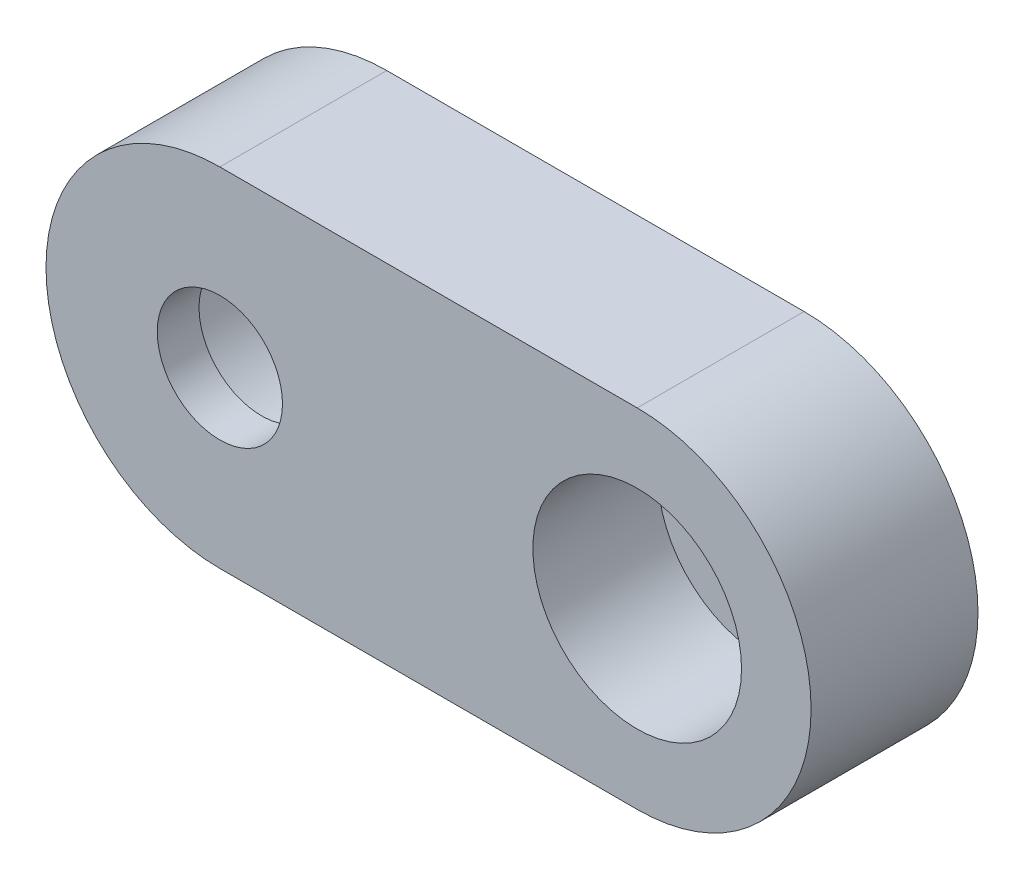
ISO-10303-21;
HEADER;
FILE_DESCRIPTION(('STEP AP214'),'2;1');
FILE_NAME('part.step','',(''),(''),'','','');
FILE_SCHEMA(('AUTOMOTIVE_DESIGN { 1 0 10303 214 1 1 1 1 }'));
ENDSEC;
DATA;
#1=APPLICATION_CONTEXT('core data for automotive mechanical design processes');
#2=APPLICATION_PROTOCOL_DEFINITION('international standard','automotive_design',2000,#1);
#3=PRODUCT_CONTEXT('',#1,'mechanical');
#4=PRODUCT('Part','Part','',(#3));
#5=PRODUCT_RELATED_PRODUCT_CATEGORY('part','',(#4));
#6=PRODUCT_DEFINITION_FORMATION('','',#4);
#7=PRODUCT_DEFINITION_CONTEXT('part definition',#1,'design');
#8=PRODUCT_DEFINITION('design','',#6,#7);
#9=PRODUCT_DEFINITION_SHAPE('','',#8);
#10=(LENGTH_UNIT() NAMED_UNIT(*) SI_UNIT(.MILLI.,.METRE.));
#11=(NAMED_UNIT(*) PLANE_ANGLE_UNIT() SI_UNIT($,.RADIAN.));
#12=(NAMED_UNIT(*) SI_UNIT($,.STERADIAN.) SOLID_ANGLE_UNIT());
#13=UNCERTAINTY_MEASURE_WITH_UNIT(LENGTH_MEASURE(1.E-05),#10,'distance_accuracy_value','');
#14=(GEOMETRIC_REPRESENTATION_CONTEXT(3) GLOBAL_UNCERTAINTY_ASSIGNED_CONTEXT((#13)) GLOBAL_UNIT_ASSIGNED_CONTEXT((#10,
#11,#12)) REPRESENTATION_CONTEXT('',''));
#15=CARTESIAN_POINT('',(0.,0.,0.));
#16=DIRECTION('',(0.,0.,1.));
#17=DIRECTION('',(1.,0.,0.));
#18=AXIS2_PLACEMENT_3D('',#15,#16,#17);
#19=CARTESIAN_POINT('',(-15.,0.,12.));
#20=DIRECTION('',(0.,0.,-1.));
#21=DIRECTION('',(-1.,0.,0.));
#22=AXIS2_PLACEMENT_3D('',#19,#20,#21);
#23=CYLINDRICAL_SURFACE('',#22,12.5);
#24=CARTESIAN_POINT('',(-15.,0.,0.));
#25=DIRECTION('',(0.,0.,1.));
#26=DIRECTION('',(1.,0.,0.));
#27=AXIS2_PLACEMENT_3D('',#24,#25,#26);
#28=CIRCLE('',#27,12.5);
#29=CARTESIAN_POINT('',(-15.,12.5,0.));
#30=VERTEX_POINT('',#29);
#31=CARTESIAN_POINT('',(-15.,-12.5,0.));
#32=VERTEX_POINT('',#31);
#33=EDGE_CURVE('E101',#30,#32,#28,.T.);
#34=ORIENTED_EDGE('',*,*,#33,.T.);
#35=DIRECTION('',(0.,0.,-1.));
#36=VECTOR('',#35,1.);
#37=CARTESIAN_POINT('',(-15.,-12.5,12.));
#38=LINE('',#37,#36);
#39=CARTESIAN_POINT('',(-15.,-12.5,12.));
#40=VERTEX_POINT('',#39);
#41=EDGE_CURVE('E11',#40,#32,#38,.T.);
#42=ORIENTED_EDGE('',*,*,#41,.F.);
#43=CARTESIAN_POINT('',(-15.,0.,12.));
#44=DIRECTION('',(0.,0.,1.));
#45=DIRECTION('',(1.,0.,0.));
#46=AXIS2_PLACEMENT_3D('',#43,#44,#45);
#47=CIRCLE('',#46,12.5);
#48=CARTESIAN_POINT('',(-15.,12.5,12.));
#49=VERTEX_POINT('',#48);
#50=EDGE_CURVE('E88',#49,#40,#47,.T.);
#51=ORIENTED_EDGE('',*,*,#50,.F.);
#52=DIRECTION('',(0.,0.,-1.));
#53=VECTOR('',#52,1.);
#54=CARTESIAN_POINT('',(-15.,12.5,12.));
#55=LINE('',#54,#53);
#56=EDGE_CURVE('E97',#49,#30,#55,.T.);
#57=ORIENTED_EDGE('',*,*,#56,.T.);
#58=EDGE_LOOP('',(#34,#42,#51,#57));
#59=FACE_BOUND('',#58,.T.);
#60=ADVANCED_FACE('F35',(#59),#23,.T.);
#61=CARTESIAN_POINT('',(-15.,-12.5,12.));
#62=DIRECTION('',(0.,1.,0.));
#63=DIRECTION('',(-1.,0.,0.));
#64=AXIS2_PLACEMENT_3D('',#61,#62,#63);
#65=PLANE('',#64);
#66=DIRECTION('',(1.,0.,0.));
#67=VECTOR('',#66,1.);
#68=CARTESIAN_POINT('',(-15.,-12.5,0.));
#69=LINE('',#68,#67);
#70=CARTESIAN_POINT('',(15.,-12.5,0.));
#71=VERTEX_POINT('',#70);
#72=EDGE_CURVE('E92',#32,#71,#69,.T.);
#73=ORIENTED_EDGE('',*,*,#72,.T.);
#74=DIRECTION('',(0.,0.,-1.));
#75=VECTOR('',#74,1.);
#76=CARTESIAN_POINT('',(15.,-12.5,12.));
#77=LINE('',#76,#75);
#78=CARTESIAN_POINT('',(15.,-12.5,12.));
#79=VERTEX_POINT('',#78);
#80=EDGE_CURVE('E44',#79,#71,#77,.T.);
#81=ORIENTED_EDGE('',*,*,#80,.F.);
#82=DIRECTION('',(1.,0.,0.));
#83=VECTOR('',#82,1.);
#84=CARTESIAN_POINT('',(-15.,-12.5,12.));
#85=LINE('',#84,#83);
#86=EDGE_CURVE('E83',#40,#79,#85,.T.);
#87=ORIENTED_EDGE('',*,*,#86,.F.);
#88=ORIENTED_EDGE('',*,*,#41,.T.);
#89=EDGE_LOOP('',(#73,#81,#87,#88));
#90=FACE_BOUND('',#89,.T.);
#91=ADVANCED_FACE('F91',(#90),#65,.F.);
#92=CARTESIAN_POINT('',(15.,0.,12.));
#93=DIRECTION('',(0.,0.,-1.));
#94=DIRECTION('',(-1.,0.,0.));
#95=AXIS2_PLACEMENT_3D('',#92,#93,#94);
#96=CYLINDRICAL_SURFACE('',#95,12.5);
#97=CARTESIAN_POINT('',(15.,0.,0.));
#98=DIRECTION('',(0.,0.,1.));
#99=DIRECTION('',(1.,0.,0.));
#100=AXIS2_PLACEMENT_3D('',#97,#98,#99);
#101=CIRCLE('',#100,12.5);
#102=CARTESIAN_POINT('',(15.,12.5,0.));
#103=VERTEX_POINT('',#102);
#104=EDGE_CURVE('E70',#71,#103,#101,.T.);
#105=ORIENTED_EDGE('',*,*,#104,.T.);
#106=DIRECTION('',(0.,0.,-1.));
#107=VECTOR('',#106,1.);
#108=CARTESIAN_POINT('',(15.,12.5,12.));
#109=LINE('',#108,#107);
#110=CARTESIAN_POINT('',(15.,12.5,12.));
#111=VERTEX_POINT('',#110);
#112=EDGE_CURVE('E93',#111,#103,#109,.T.);
#113=ORIENTED_EDGE('',*,*,#112,.F.);
#114=CARTESIAN_POINT('',(15.,0.,12.));
#115=DIRECTION('',(0.,0.,1.));
#116=DIRECTION('',(1.,0.,0.));
#117=AXIS2_PLACEMENT_3D('',#114,#115,#116);
#118=CIRCLE('',#117,12.5);
#119=EDGE_CURVE('E86',#79,#111,#118,.T.);
#120=ORIENTED_EDGE('',*,*,#119,.F.);
#121=ORIENTED_EDGE('',*,*,#80,.T.);
#122=EDGE_LOOP('',(#105,#113,#120,#121));
#123=FACE_BOUND('',#122,.T.);
#124=ADVANCED_FACE('F95',(#123),#96,.T.);
#125=CARTESIAN_POINT('',(-15.,12.5,12.));
#126=DIRECTION('',(0.,-1.,0.));
#127=DIRECTION('',(1.,0.,0.));
#128=AXIS2_PLACEMENT_3D('',#125,#126,#127);
#129=PLANE('',#128);
#130=DIRECTION('',(-1.,0.,0.));
#131=VECTOR('',#130,1.);
#132=CARTESIAN_POINT('',(-15.,12.5,0.));
#133=LINE('',#132,#131);
#134=EDGE_CURVE('E76',#103,#30,#133,.T.);
#135=ORIENTED_EDGE('',*,*,#134,.T.);
#136=ORIENTED_EDGE('',*,*,#56,.F.);
#137=DIRECTION('',(-1.,0.,0.));
#138=VECTOR('',#137,1.);
#139=CARTESIAN_POINT('',(-15.,12.5,12.));
#140=LINE('',#139,#138);
#141=EDGE_CURVE('E53',#111,#49,#140,.T.);
#142=ORIENTED_EDGE('',*,*,#141,.F.);
#143=ORIENTED_EDGE('',*,*,#112,.T.);
#144=EDGE_LOOP('',(#135,#136,#142,#143));
#145=FACE_BOUND('',#144,.T.);
#146=ADVANCED_FACE('F139',(#145),#129,.F.);
#147=CARTESIAN_POINT('',(-15.,0.,12.));
#148=DIRECTION('',(0.,0.,1.));
#149=DIRECTION('',(1.,0.,0.));
#150=AXIS2_PLACEMENT_3D('',#147,#148,#149);
#151=PLANE('',#150);
#152=CARTESIAN_POINT('',(15.,0.,12.));
#153=DIRECTION('',(0.,0.,1.));
#154=DIRECTION('',(1.,0.,0.));
#155=AXIS2_PLACEMENT_3D('',#152,#153,#154);
#156=CIRCLE('',#155,7.5);
#157=CARTESIAN_POINT('',(22.5,0.,12.));
#158=VERTEX_POINT('',#157);
#159=EDGE_CURVE('E130',#158,#158,#156,.T.);
#160=ORIENTED_EDGE('',*,*,#159,.F.);
#161=EDGE_LOOP('',(#160));
#162=FACE_BOUND('',#161,.T.);
#163=CARTESIAN_POINT('',(-15.,0.,12.));
#164=DIRECTION('',(0.,0.,1.));
#165=DIRECTION('',(1.,0.,0.));
#166=AXIS2_PLACEMENT_3D('',#163,#164,#165);
#167=CIRCLE('',#166,4.5);
#168=CARTESIAN_POINT('',(-10.5,0.,12.));
#169=VERTEX_POINT('',#168);
#170=EDGE_CURVE('E104',#169,#169,#167,.T.);
#171=ORIENTED_EDGE('',*,*,#170,.F.);
#172=EDGE_LOOP('',(#171));
#173=FACE_BOUND('',#172,.T.);
#174=ORIENTED_EDGE('',*,*,#50,.T.);
#175=ORIENTED_EDGE('',*,*,#86,.T.);
#176=ORIENTED_EDGE('',*,*,#119,.T.);
#177=ORIENTED_EDGE('',*,*,#141,.T.);
#178=EDGE_LOOP('',(#174,#175,#176,#177));
#179=FACE_BOUND('',#178,.T.);
#180=ADVANCED_FACE('F84',(#162,#173,#179),#151,.T.);
#181=CARTESIAN_POINT('',(-15.,0.,0.));
#182=DIRECTION('',(0.,0.,1.));
#183=DIRECTION('',(1.,0.,0.));
#184=AXIS2_PLACEMENT_3D('',#181,#182,#183);
#185=PLANE('',#184);
#186=CARTESIAN_POINT('',(15.,0.,0.));
#187=DIRECTION('',(0.,0.,1.));
#188=DIRECTION('',(1.,0.,0.));
#189=AXIS2_PLACEMENT_3D('',#186,#187,#188);
#190=CIRCLE('',#189,4.5);
#191=CARTESIAN_POINT('',(19.5,0.,0.));
#192=VERTEX_POINT('',#191);
#193=EDGE_CURVE('E38',#192,#192,#190,.T.);
#194=ORIENTED_EDGE('',*,*,#193,.T.);
#195=EDGE_LOOP('',(#194));
#196=FACE_BOUND('',#195,.T.);
#197=CARTESIAN_POINT('',(-15.,0.,0.));
#198=DIRECTION('',(0.,0.,-1.));
#199=DIRECTION('',(-1.,0.,0.));
#200=AXIS2_PLACEMENT_3D('',#197,#198,#199);
#201=CIRCLE('',#200,7.5);
#202=CARTESIAN_POINT('',(-22.5,0.,0.));
#203=VERTEX_POINT('',#202);
#204=EDGE_CURVE('E119',#203,#203,#201,.T.);
#205=ORIENTED_EDGE('',*,*,#204,.F.);
#206=EDGE_LOOP('',(#205));
#207=FACE_BOUND('',#206,.T.);
#208=ORIENTED_EDGE('',*,*,#33,.F.);
#209=ORIENTED_EDGE('',*,*,#134,.F.);
#210=ORIENTED_EDGE('',*,*,#104,.F.);
#211=ORIENTED_EDGE('',*,*,#72,.F.);
#212=EDGE_LOOP('',(#208,#209,#210,#211));
#213=FACE_BOUND('',#212,.T.);
#214=ADVANCED_FACE('F138',(#196,#207,#213),#185,.F.);
#215=CARTESIAN_POINT('',(-15.,0.,0.));
#216=DIRECTION('',(0.,0.,-1.));
#217=DIRECTION('',(-1.,0.,0.));
#218=AXIS2_PLACEMENT_3D('',#215,#216,#217);
#219=CYLINDRICAL_SURFACE('',#218,4.5);
#220=ORIENTED_EDGE('',*,*,#170,.T.);
#221=EDGE_LOOP('',(#220));
#222=FACE_BOUND('',#221,.T.);
#223=CARTESIAN_POINT('',(-15.,0.,9.));
#224=DIRECTION('',(0.,0.,-1.));
#225=DIRECTION('',(-1.,0.,0.));
#226=AXIS2_PLACEMENT_3D('',#223,#224,#225);
#227=CIRCLE('',#226,4.5);
#228=CARTESIAN_POINT('',(-19.5,0.,9.));
#229=VERTEX_POINT('',#228);
#230=EDGE_CURVE('E110',#229,#229,#227,.T.);
#231=ORIENTED_EDGE('',*,*,#230,.T.);
#232=EDGE_LOOP('',(#231));
#233=FACE_BOUND('',#232,.T.);
#234=ADVANCED_FACE('F145',(#222,#233),#219,.F.);
#235=CARTESIAN_POINT('',(-10.5,0.,9.));
#236=DIRECTION('',(0.,0.,1.));
#237=DIRECTION('',(1.,0.,0.));
#238=AXIS2_PLACEMENT_3D('',#235,#236,#237);
#239=PLANE('',#238);
#240=ORIENTED_EDGE('',*,*,#230,.F.);
#241=EDGE_LOOP('',(#240));
#242=FACE_BOUND('',#241,.T.);
#243=CARTESIAN_POINT('',(-15.,0.,9.));
#244=DIRECTION('',(0.,0.,-1.));
#245=DIRECTION('',(-1.,0.,0.));
#246=AXIS2_PLACEMENT_3D('',#243,#244,#245);
#247=CIRCLE('',#246,7.5);
#248=CARTESIAN_POINT('',(-22.5,0.,9.));
#249=VERTEX_POINT('',#248);
#250=EDGE_CURVE('E114',#249,#249,#247,.T.);
#251=ORIENTED_EDGE('',*,*,#250,.T.);
#252=EDGE_LOOP('',(#251));
#253=FACE_BOUND('',#252,.T.);
#254=ADVANCED_FACE('F177',(#242,#253),#239,.F.);
#255=CARTESIAN_POINT('',(-15.,0.,0.));
#256=DIRECTION('',(0.,0.,-1.));
#257=DIRECTION('',(-1.,0.,0.));
#258=AXIS2_PLACEMENT_3D('',#255,#256,#257);
#259=CYLINDRICAL_SURFACE('',#258,7.5);
#260=ORIENTED_EDGE('',*,*,#250,.F.);
#261=EDGE_LOOP('',(#260));
#262=FACE_BOUND('',#261,.T.);
#263=ORIENTED_EDGE('',*,*,#204,.T.);
#264=EDGE_LOOP('',(#263));
#265=FACE_BOUND('',#264,.T.);
#266=ADVANCED_FACE('F186',(#262,#265),#259,.F.);
#267=CARTESIAN_POINT('',(15.,0.,12.));
#268=DIRECTION('',(0.,0.,1.));
#269=DIRECTION('',(1.,0.,0.));
#270=AXIS2_PLACEMENT_3D('',#267,#268,#269);
#271=CYLINDRICAL_SURFACE('',#270,4.5);
#272=CARTESIAN_POINT('',(15.,0.,3.));
#273=DIRECTION('',(0.,0.,1.));
#274=DIRECTION('',(1.,0.,0.));
#275=AXIS2_PLACEMENT_3D('',#272,#273,#274);
#276=CIRCLE('',#275,4.5);
#277=CARTESIAN_POINT('',(19.5,0.,3.));
#278=VERTEX_POINT('',#277);
#279=EDGE_CURVE('E124',#278,#278,#276,.T.);
#280=ORIENTED_EDGE('',*,*,#279,.T.);
#281=EDGE_LOOP('',(#280));
#282=FACE_BOUND('',#281,.T.);
#283=ORIENTED_EDGE('',*,*,#193,.F.);
#284=EDGE_LOOP('',(#283));
#285=FACE_BOUND('',#284,.T.);
#286=ADVANCED_FACE('F195',(#282,#285),#271,.F.);
#287=CARTESIAN_POINT('',(19.5,0.,3.));
#288=DIRECTION('',(0.,0.,-1.));
#289=DIRECTION('',(-1.,0.,0.));
#290=AXIS2_PLACEMENT_3D('',#287,#288,#289);
#291=PLANE('',#290);
#292=ORIENTED_EDGE('',*,*,#279,.F.);
#293=EDGE_LOOP('',(#292));
#294=FACE_BOUND('',#293,.T.);
#295=CARTESIAN_POINT('',(15.,0.,3.));
#296=DIRECTION('',(0.,0.,1.));
#297=DIRECTION('',(1.,0.,0.));
#298=AXIS2_PLACEMENT_3D('',#295,#296,#297);
#299=CIRCLE('',#298,7.5);
#300=CARTESIAN_POINT('',(22.5,0.,3.));
#301=VERTEX_POINT('',#300);
#302=EDGE_CURVE('E127',#301,#301,#299,.T.);
#303=ORIENTED_EDGE('',*,*,#302,.T.);
#304=EDGE_LOOP('',(#303));
#305=FACE_BOUND('',#304,.T.);
#306=ADVANCED_FACE('F214',(#294,#305),#291,.F.);
#307=CARTESIAN_POINT('',(15.,0.,12.));
#308=DIRECTION('',(0.,0.,1.));
#309=DIRECTION('',(1.,0.,0.));
#310=AXIS2_PLACEMENT_3D('',#307,#308,#309);
#311=CYLINDRICAL_SURFACE('',#310,7.5);
#312=ORIENTED_EDGE('',*,*,#302,.F.);
#313=EDGE_LOOP('',(#312));
#314=FACE_BOUND('',#313,.T.);
#315=ORIENTED_EDGE('',*,*,#159,.T.);
#316=EDGE_LOOP('',(#315));
#317=FACE_BOUND('',#316,.T.);
#318=ADVANCED_FACE('F134',(#314,#317),#311,.F.);
#319=CLOSED_SHELL('',(#60,#91,#124,#146,#180,#214,#234,#254,#266,#286,#306,#318));
#320=MANIFOLD_SOLID_BREP('B2',#319);
#321=ADVANCED_BREP_SHAPE_REPRESENTATION('',(#18,#320),#14);
#322=SHAPE_DEFINITION_REPRESENTATION(#9,#321);
ENDSEC;
END-ISO-10303-21;
